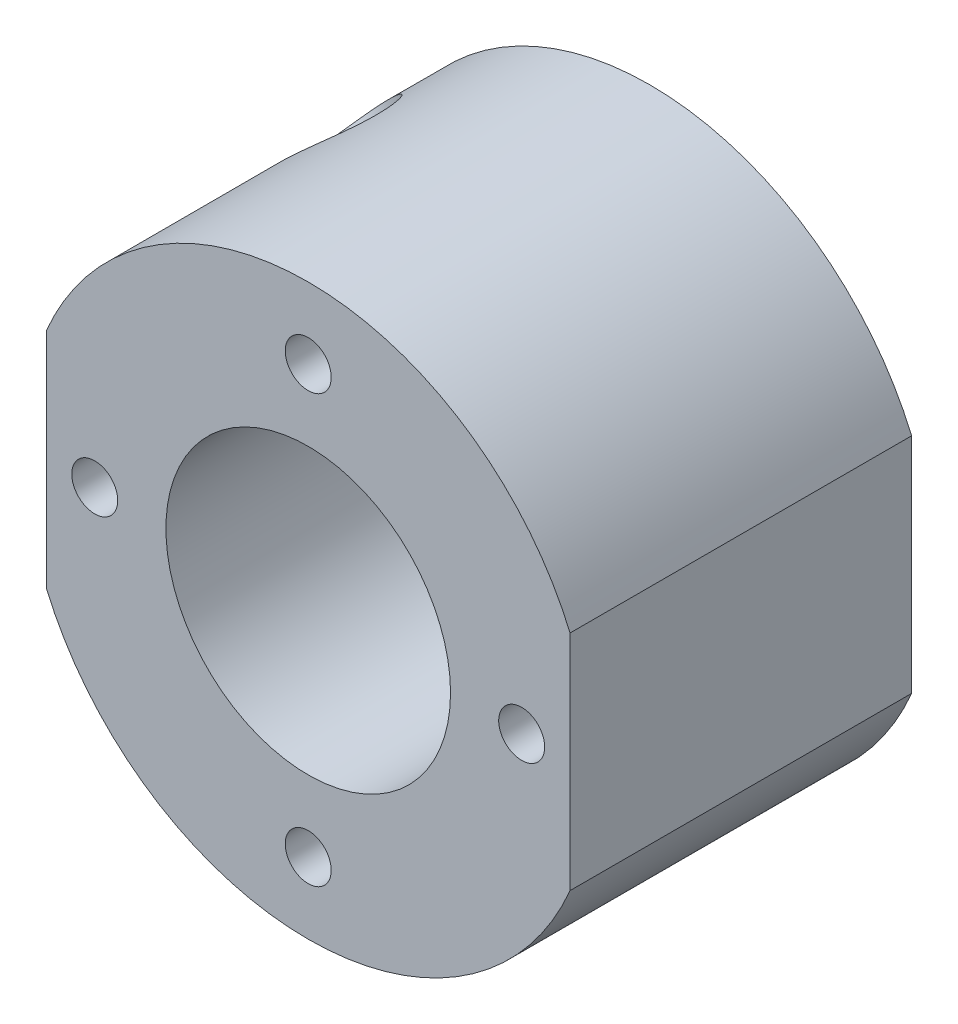
ISO-10303-21;
HEADER;
FILE_DESCRIPTION(('STEP AP214'),'2;1');
FILE_NAME('part.step','',(''),(''),'','','');
FILE_SCHEMA(('AUTOMOTIVE_DESIGN { 1 0 10303 214 1 1 1 1 }'));
ENDSEC;
DATA;
#1=APPLICATION_CONTEXT('core data for automotive mechanical design processes');
#2=APPLICATION_PROTOCOL_DEFINITION('international standard','automotive_design',2000,#1);
#3=PRODUCT_CONTEXT('',#1,'mechanical');
#4=PRODUCT('Part','Part','',(#3));
#5=PRODUCT_RELATED_PRODUCT_CATEGORY('part','',(#4));
#6=PRODUCT_DEFINITION_FORMATION('','',#4);
#7=PRODUCT_DEFINITION_CONTEXT('part definition',#1,'design');
#8=PRODUCT_DEFINITION('design','',#6,#7);
#9=PRODUCT_DEFINITION_SHAPE('','',#8);
#10=(LENGTH_UNIT() NAMED_UNIT(*) SI_UNIT(.MILLI.,.METRE.));
#11=(NAMED_UNIT(*) PLANE_ANGLE_UNIT() SI_UNIT($,.RADIAN.));
#12=(NAMED_UNIT(*) SI_UNIT($,.STERADIAN.) SOLID_ANGLE_UNIT());
#13=UNCERTAINTY_MEASURE_WITH_UNIT(LENGTH_MEASURE(1.E-05),#10,'distance_accuracy_value','');
#14=(GEOMETRIC_REPRESENTATION_CONTEXT(3) GLOBAL_UNCERTAINTY_ASSIGNED_CONTEXT((#13)) GLOBAL_UNIT_ASSIGNED_CONTEXT((#10,
#11,#12)) REPRESENTATION_CONTEXT('',''));
#15=CARTESIAN_POINT('',(0.,0.,0.));
#16=DIRECTION('',(0.,0.,1.));
#17=DIRECTION('',(1.,0.,0.));
#18=AXIS2_PLACEMENT_3D('',#15,#16,#17);
#19=CARTESIAN_POINT('',(0.,0.,30.));
#20=DIRECTION('',(0.,0.,-1.));
#21=DIRECTION('',(-1.,0.,0.));
#22=AXIS2_PLACEMENT_3D('',#19,#20,#21);
#23=CYLINDRICAL_SURFACE('',#22,25.);
#24=CARTESIAN_POINT('',(-20.0332050080004,14.9556242633809,6.91023024597755));
#25=CARTESIAN_POINT('',(-19.9287063934799,15.0955985597925,6.70821432387531));
#26=CARTESIAN_POINT('',(-19.8125774078437,15.2480893048571,6.52071400679506));
#27=CARTESIAN_POINT('',(-19.55866430455,15.5724448581325,6.18004120157919));
#28=CARTESIAN_POINT('',(-19.4208623982199,15.7443255481422,6.0268971651168));
#29=CARTESIAN_POINT('',(-19.1259026800403,16.1013476581232,5.75942461624544));
#30=CARTESIAN_POINT('',(-18.9687395079276,16.2864927444457,5.64510688615283));
#31=CARTESIAN_POINT('',(-18.6383441964005,16.6635794148504,5.4588773054193));
#32=CARTESIAN_POINT('',(-18.4651164437809,16.8555191347054,5.38695391728274));
#33=CARTESIAN_POINT('',(-18.1090026496365,17.2374980909467,5.28838876364411));
#34=CARTESIAN_POINT('',(-17.9262619983531,17.4275315864336,5.26119971038429));
#35=CARTESIAN_POINT('',(-17.5542018287811,17.8022383051362,5.25127960944358));
#36=CARTESIAN_POINT('',(-17.3648826034947,17.9869117664113,5.2685465842377));
#37=CARTESIAN_POINT('',(-16.9876648284346,18.3435505715674,5.34649363316186));
#38=CARTESIAN_POINT('',(-16.7997766378151,18.5156422034272,5.40664823033089));
#39=CARTESIAN_POINT('',(-16.4290083835832,18.8454049716102,5.56792625292055));
#40=CARTESIAN_POINT('',(-16.2461285604558,19.0030754163235,5.6690516419535));
#41=CARTESIAN_POINT('',(-15.8897704914387,19.3020678054954,5.91034499956599));
#42=CARTESIAN_POINT('',(-15.716387915255,19.4432355326298,6.0508450845756));
#43=CARTESIAN_POINT('',(-15.3866554882491,19.7052087669399,6.36654304788941));
#44=CARTESIAN_POINT('',(-15.2303074993113,19.8260120490652,6.54174471319887));
#45=CARTESIAN_POINT('',(-14.9376928590393,20.0474348374352,6.92540557682946));
#46=CARTESIAN_POINT('',(-14.8018182464355,20.1476710755374,7.13438538554393));
#47=CARTESIAN_POINT('',(-14.5586969091372,20.3240492962131,7.57764774059796));
#48=CARTESIAN_POINT('',(-14.4514505264438,20.4001909909484,7.81193058916794));
#49=CARTESIAN_POINT('',(-14.2698280318802,20.5276498791749,8.29981335928426));
#50=CARTESIAN_POINT('',(-14.1955158750061,20.5789187902996,8.55344975420847));
#51=CARTESIAN_POINT('',(-14.0833477713645,20.6558465301357,9.07239376590262));
#52=CARTESIAN_POINT('',(-14.0454880253928,20.6815080277559,9.33770016336749));
#53=CARTESIAN_POINT('',(-14.0082123101428,20.706774099192,9.86852267508543));
#54=CARTESIAN_POINT('',(-14.0082720222142,20.7067340524521,10.1339851677836));
#55=CARTESIAN_POINT('',(-14.0455192208603,20.681486458748,10.6610708923707));
#56=CARTESIAN_POINT('',(-14.0827056261775,20.6562796447271,10.9226942358439));
#57=CARTESIAN_POINT('',(-14.1922305591425,20.5811788662343,11.4332191720971));
#58=CARTESIAN_POINT('',(-14.2643720063603,20.5314232820725,11.6821835438694));
#59=CARTESIAN_POINT('',(-14.440664532367,20.4078106796837,12.1621473013387));
#60=CARTESIAN_POINT('',(-14.5448182049398,20.3339517084549,12.3931452294072));
#61=CARTESIAN_POINT('',(-14.7824133067166,20.1618936737046,12.8336514674126));
#62=CARTESIAN_POINT('',(-14.9161930852507,20.0634115687872,13.0428667248079));
#63=CARTESIAN_POINT('',(-15.2071664759439,19.8437708519755,13.4309251639909));
#64=CARTESIAN_POINT('',(-15.36436173669,19.7226106432555,13.6097662053568));
#65=CARTESIAN_POINT('',(-15.6980338209317,19.4580935961814,13.9336688138318));
#66=CARTESIAN_POINT('',(-15.8746792586924,19.314537280783,14.0783941878825));
#67=CARTESIAN_POINT('',(-16.2397174148653,19.008634904286,14.3275858903805));
#68=CARTESIAN_POINT('',(-16.4281092798501,18.8462902075108,14.4320551396549));
#69=CARTESIAN_POINT('',(-16.8081796761071,18.5080817502816,14.5966290318184));
#70=CARTESIAN_POINT('',(-16.9998040357054,18.3323752410588,14.6571815027394));
#71=CARTESIAN_POINT('',(-17.3819805864821,17.9704192272476,14.7337196851817));
#72=CARTESIAN_POINT('',(-17.5725328975655,17.784170928573,14.7497104838055));
#73=CARTESIAN_POINT('',(-17.9436487805272,17.4095906990046,14.7367217996727));
#74=CARTESIAN_POINT('',(-18.124325719045,17.2213448194854,14.7084851721147));
#75=CARTESIAN_POINT('',(-18.4742130929309,16.8454565688639,14.6093250683516));
#76=CARTESIAN_POINT('',(-18.6434234931844,16.6578141996115,14.5384014614313));
#77=CARTESIAN_POINT('',(-18.9665591773802,16.2889489744697,14.3559789469341));
#78=CARTESIAN_POINT('',(-19.1204724093069,16.1077312514788,14.2444483643499));
#79=CARTESIAN_POINT('',(-19.4098640693997,15.7578170863309,13.984069692164));
#80=CARTESIAN_POINT('',(-19.5453405643748,15.5891219580769,13.8352176938553));
#81=CARTESIAN_POINT('',(-19.7977950218222,15.2672825043082,13.5014782350919));
#82=CARTESIAN_POINT('',(-19.9144194414495,15.1144512171008,13.3160213038499));
#83=CARTESIAN_POINT('',(-20.1247229153359,14.8332879191097,12.9158204216847));
#84=CARTESIAN_POINT('',(-20.2184004393244,14.7049575423557,12.7010745190395));
#85=CARTESIAN_POINT('',(-20.3824740257899,14.4766975837517,12.2459269480198));
#86=CARTESIAN_POINT('',(-20.4526391762873,14.3770509709516,12.0052998263121));
#87=CARTESIAN_POINT('',(-20.5676505013571,14.2120349692608,11.5068608666643));
#88=CARTESIAN_POINT('',(-20.6124993146063,14.1466620081392,11.2490508228024));
#89=CARTESIAN_POINT('',(-20.6760752266503,14.0535793377942,10.7263338165391));
#90=CARTESIAN_POINT('',(-20.695062997456,14.0254938551046,10.4615255249159));
#91=CARTESIAN_POINT('',(-20.7075578346279,14.0070406065217,9.92996415976184));
#92=CARTESIAN_POINT('',(-20.7010627190839,14.0166760703928,9.6632109216515));
#93=CARTESIAN_POINT('',(-20.6628792758397,14.0729003527401,9.13852206335549));
#94=CARTESIAN_POINT('',(-20.6314720099464,14.1190768968851,8.88052136393451));
#95=CARTESIAN_POINT('',(-20.5441508985975,14.2458323777527,8.37759924907437));
#96=CARTESIAN_POINT('',(-20.4882549475655,14.3263861931321,8.13266842951528));
#97=CARTESIAN_POINT('',(-20.3692515340359,14.4948742030161,7.72016751666249));
#98=CARTESIAN_POINT('',(-20.3112651827072,14.5761661312453,7.54834495334402));
#99=CARTESIAN_POINT('',(-20.1820610427669,14.7545435642983,7.2184206466158));
#100=CARTESIAN_POINT('',(-20.110842915422,14.8516294734397,7.06031925461986));
#101=CARTESIAN_POINT('',(-20.0332050080004,14.9556242633809,6.91023024597755));
#102=B_SPLINE_CURVE_WITH_KNOTS('',3,(#24,#25,#26,#27,#28,#29,#30,#31,#32,#33,#34,#35,#36,#37,
#38,#39,#40,#41,#42,#43,#44,#45,#46,#47,#48,#49,#50,#51,#52,#53,#54,#55,#56,#57,#58,#59,#60,#61,
#62,#63,#64,#65,#66,#67,#68,#69,#70,#71,#72,#73,#74,#75,#76,#77,#78,#79,#80,#81,#82,#83,#84,#85,
#86,#87,#88,#89,#90,#91,#92,#93,#94,#95,#96,#97,#98,#99,#100,#101),.UNSPECIFIED.,.T.,.F.,(4,2,2,
2,2,2,2,2,2,2,2,2,2,2,2,2,2,2,2,2,2,2,2,2,2,2,2,2,2,2,2,2,2,2,2,2,2,2,4),(0.,0.800483583623166,
1.60162764933025,2.40299401635645,3.20414219306571,3.99541405810369,4.78665072582606,
5.56835584573025,6.35009843494714,7.13864428502347,7.92727623706531,8.72948460596087,
9.53170255783908,10.3354715835523,11.139156828435,11.9317296291704,12.7242793481191,
13.512411681542,14.3006078900636,15.0983182075175,15.8960847150241,16.7014117122949,
17.5066802671775,18.303617243157,19.1004632381226,19.8840680523859,20.6676752662008,
21.4518950380332,22.2361969762747,23.0338291649404,23.8315145312159,24.6368187599172,
25.4420390376899,26.2390813137089,27.0361918360287,27.8244350244597,28.6121031843612,
29.2068123054358,29.8015366531514),.UNSPECIFIED.);
#103=CARTESIAN_POINT('',(-20.0332050080004,14.9556242633809,6.91023024597755));
#104=VERTEX_POINT('',#103);
#105=EDGE_CURVE('E13',#104,#104,#102,.T.);
#106=ORIENTED_EDGE('',*,*,#105,.T.);
#107=EDGE_LOOP('',(#106));
#108=FACE_BOUND('',#107,.T.);
#109=CARTESIAN_POINT('',(0.,0.,0.));
#110=DIRECTION('',(0.,0.,1.));
#111=DIRECTION('',(1.,0.,0.));
#112=AXIS2_PLACEMENT_3D('',#109,#110,#111);
#113=CIRCLE('',#112,25.);
#114=CARTESIAN_POINT('',(23.,9.79795897113274,0.));
#115=VERTEX_POINT('',#114);
#116=CARTESIAN_POINT('',(-23.,9.79795897113273,0.));
#117=VERTEX_POINT('',#116);
#118=EDGE_CURVE('E118',#115,#117,#113,.T.);
#119=ORIENTED_EDGE('',*,*,#118,.T.);
#120=DIRECTION('',(0.,0.,-1.));
#121=VECTOR('',#120,1.);
#122=CARTESIAN_POINT('',(-23.,9.79795897113273,30.));
#123=LINE('',#122,#121);
#124=CARTESIAN_POINT('',(-23.,9.79795897113273,30.));
#125=VERTEX_POINT('',#124);
#126=EDGE_CURVE('E60',#125,#117,#123,.T.);
#127=ORIENTED_EDGE('',*,*,#126,.F.);
#128=CARTESIAN_POINT('',(0.,0.,30.));
#129=DIRECTION('',(0.,0.,1.));
#130=DIRECTION('',(1.,0.,0.));
#131=AXIS2_PLACEMENT_3D('',#128,#129,#130);
#132=CIRCLE('',#131,25.);
#133=CARTESIAN_POINT('',(23.,9.79795897113274,30.));
#134=VERTEX_POINT('',#133);
#135=EDGE_CURVE('E104',#134,#125,#132,.T.);
#136=ORIENTED_EDGE('',*,*,#135,.F.);
#137=DIRECTION('',(0.,0.,-1.));
#138=VECTOR('',#137,1.);
#139=CARTESIAN_POINT('',(23.,9.79795897113274,30.));
#140=LINE('',#139,#138);
#141=EDGE_CURVE('E114',#134,#115,#140,.T.);
#142=ORIENTED_EDGE('',*,*,#141,.T.);
#143=EDGE_LOOP('',(#119,#127,#136,#142));
#144=FACE_BOUND('',#143,.T.);
#145=ADVANCED_FACE('F48',(#108,#144),#23,.T.);
#146=CARTESIAN_POINT('',(-23.,9.79795897113273,30.));
#147=DIRECTION('',(1.,0.,0.));
#148=DIRECTION('',(0.,0.,-1.));
#149=AXIS2_PLACEMENT_3D('',#146,#147,#148);
#150=PLANE('',#149);
#151=DIRECTION('',(0.,-1.,0.));
#152=VECTOR('',#151,1.);
#153=CARTESIAN_POINT('',(-23.,9.79795897113273,0.));
#154=LINE('',#153,#152);
#155=CARTESIAN_POINT('',(-23.,-9.79795897113273,0.));
#156=VERTEX_POINT('',#155);
#157=EDGE_CURVE('E109',#117,#156,#154,.T.);
#158=ORIENTED_EDGE('',*,*,#157,.T.);
#159=DIRECTION('',(0.,0.,-1.));
#160=VECTOR('',#159,1.);
#161=CARTESIAN_POINT('',(-23.,-9.79795897113273,30.));
#162=LINE('',#161,#160);
#163=CARTESIAN_POINT('',(-23.,-9.79795897113273,30.));
#164=VERTEX_POINT('',#163);
#165=EDGE_CURVE('E107',#164,#156,#162,.T.);
#166=ORIENTED_EDGE('',*,*,#165,.F.);
#167=DIRECTION('',(0.,-1.,0.));
#168=VECTOR('',#167,1.);
#169=CARTESIAN_POINT('',(-23.,9.79795897113273,30.));
#170=LINE('',#169,#168);
#171=EDGE_CURVE('E99',#125,#164,#170,.T.);
#172=ORIENTED_EDGE('',*,*,#171,.F.);
#173=ORIENTED_EDGE('',*,*,#126,.T.);
#174=EDGE_LOOP('',(#158,#166,#172,#173));
#175=FACE_BOUND('',#174,.T.);
#176=ADVANCED_FACE('F108',(#175),#150,.F.);
#177=CARTESIAN_POINT('',(0.,0.,30.));
#178=DIRECTION('',(0.,0.,-1.));
#179=DIRECTION('',(-1.,0.,0.));
#180=AXIS2_PLACEMENT_3D('',#177,#178,#179);
#181=CYLINDRICAL_SURFACE('',#180,25.);
#182=CARTESIAN_POINT('',(0.,0.,0.));
#183=DIRECTION('',(0.,0.,1.));
#184=DIRECTION('',(1.,0.,0.));
#185=AXIS2_PLACEMENT_3D('',#182,#183,#184);
#186=CIRCLE('',#185,25.);
#187=CARTESIAN_POINT('',(23.,-9.79795897113272,0.));
#188=VERTEX_POINT('',#187);
#189=EDGE_CURVE('E85',#156,#188,#186,.T.);
#190=ORIENTED_EDGE('',*,*,#189,.T.);
#191=DIRECTION('',(0.,0.,-1.));
#192=VECTOR('',#191,1.);
#193=CARTESIAN_POINT('',(23.,-9.79795897113272,30.));
#194=LINE('',#193,#192);
#195=CARTESIAN_POINT('',(23.,-9.79795897113272,30.));
#196=VERTEX_POINT('',#195);
#197=EDGE_CURVE('E110',#196,#188,#194,.T.);
#198=ORIENTED_EDGE('',*,*,#197,.F.);
#199=CARTESIAN_POINT('',(0.,0.,30.));
#200=DIRECTION('',(0.,0.,1.));
#201=DIRECTION('',(1.,0.,0.));
#202=AXIS2_PLACEMENT_3D('',#199,#200,#201);
#203=CIRCLE('',#202,25.);
#204=EDGE_CURVE('E102',#164,#196,#203,.T.);
#205=ORIENTED_EDGE('',*,*,#204,.F.);
#206=ORIENTED_EDGE('',*,*,#165,.T.);
#207=EDGE_LOOP('',(#190,#198,#205,#206));
#208=FACE_BOUND('',#207,.T.);
#209=ADVANCED_FACE('F112',(#208),#181,.T.);
#210=CARTESIAN_POINT('',(23.,9.79795897113274,30.));
#211=DIRECTION('',(-1.,0.,0.));
#212=DIRECTION('',(0.,-1.,0.));
#213=AXIS2_PLACEMENT_3D('',#210,#211,#212);
#214=PLANE('',#213);
#215=DIRECTION('',(0.,1.,0.));
#216=VECTOR('',#215,1.);
#217=CARTESIAN_POINT('',(23.,9.79795897113274,0.));
#218=LINE('',#217,#216);
#219=EDGE_CURVE('E91',#188,#115,#218,.T.);
#220=ORIENTED_EDGE('',*,*,#219,.T.);
#221=ORIENTED_EDGE('',*,*,#141,.F.);
#222=DIRECTION('',(0.,1.,0.));
#223=VECTOR('',#222,1.);
#224=CARTESIAN_POINT('',(23.,9.79795897113274,30.));
#225=LINE('',#224,#223);
#226=EDGE_CURVE('E68',#196,#134,#225,.T.);
#227=ORIENTED_EDGE('',*,*,#226,.F.);
#228=ORIENTED_EDGE('',*,*,#197,.T.);
#229=EDGE_LOOP('',(#220,#221,#227,#228));
#230=FACE_BOUND('',#229,.T.);
#231=ADVANCED_FACE('F141',(#230),#214,.F.);
#232=CARTESIAN_POINT('',(0.,0.,30.));
#233=DIRECTION('',(0.,0.,1.));
#234=DIRECTION('',(1.,0.,0.));
#235=AXIS2_PLACEMENT_3D('',#232,#233,#234);
#236=PLANE('',#235);
#237=CARTESIAN_POINT('',(-18.75,0.,30.));
#238=DIRECTION('',(0.,0.,1.));
#239=DIRECTION('',(1.,0.,0.));
#240=AXIS2_PLACEMENT_3D('',#237,#238,#239);
#241=CIRCLE('',#240,2.01929999999999);
#242=CARTESIAN_POINT('',(-16.7307,0.,30.));
#243=VERTEX_POINT('',#242);
#244=EDGE_CURVE('E184',#243,#243,#241,.T.);
#245=ORIENTED_EDGE('',*,*,#244,.F.);
#246=EDGE_LOOP('',(#245));
#247=FACE_BOUND('',#246,.T.);
#248=CARTESIAN_POINT('',(0.,18.75,30.));
#249=DIRECTION('',(0.,0.,1.));
#250=DIRECTION('',(1.,0.,0.));
#251=AXIS2_PLACEMENT_3D('',#248,#249,#250);
#252=CIRCLE('',#251,2.01929999999999);
#253=CARTESIAN_POINT('',(2.01929999999999,18.75,30.));
#254=VERTEX_POINT('',#253);
#255=EDGE_CURVE('E191',#254,#254,#252,.T.);
#256=ORIENTED_EDGE('',*,*,#255,.F.);
#257=EDGE_LOOP('',(#256));
#258=FACE_BOUND('',#257,.T.);
#259=CARTESIAN_POINT('',(18.75,0.,30.));
#260=DIRECTION('',(0.,0.,1.));
#261=DIRECTION('',(1.,0.,0.));
#262=AXIS2_PLACEMENT_3D('',#259,#260,#261);
#263=CIRCLE('',#262,2.01929999999999);
#264=CARTESIAN_POINT('',(20.7693,0.,30.));
#265=VERTEX_POINT('',#264);
#266=EDGE_CURVE('E197',#265,#265,#263,.T.);
#267=ORIENTED_EDGE('',*,*,#266,.F.);
#268=EDGE_LOOP('',(#267));
#269=FACE_BOUND('',#268,.T.);
#270=CARTESIAN_POINT('',(0.,-18.75,30.));
#271=DIRECTION('',(0.,0.,1.));
#272=DIRECTION('',(1.,0.,0.));
#273=AXIS2_PLACEMENT_3D('',#270,#271,#272);
#274=CIRCLE('',#273,2.01929999999999);
#275=CARTESIAN_POINT('',(2.01929999999999,-18.75,30.));
#276=VERTEX_POINT('',#275);
#277=EDGE_CURVE('E203',#276,#276,#274,.T.);
#278=ORIENTED_EDGE('',*,*,#277,.F.);
#279=EDGE_LOOP('',(#278));
#280=FACE_BOUND('',#279,.T.);
#281=CARTESIAN_POINT('',(0.,0.,30.));
#282=DIRECTION('',(0.,0.,1.));
#283=DIRECTION('',(1.,0.,0.));
#284=AXIS2_PLACEMENT_3D('',#281,#282,#283);
#285=CIRCLE('',#284,12.5);
#286=CARTESIAN_POINT('',(12.5,0.,30.));
#287=VERTEX_POINT('',#286);
#288=EDGE_CURVE('E209',#287,#287,#285,.T.);
#289=ORIENTED_EDGE('',*,*,#288,.F.);
#290=EDGE_LOOP('',(#289));
#291=FACE_BOUND('',#290,.T.);
#292=ORIENTED_EDGE('',*,*,#135,.T.);
#293=ORIENTED_EDGE('',*,*,#171,.T.);
#294=ORIENTED_EDGE('',*,*,#204,.T.);
#295=ORIENTED_EDGE('',*,*,#226,.T.);
#296=EDGE_LOOP('',(#292,#293,#294,#295));
#297=FACE_BOUND('',#296,.T.);
#298=ADVANCED_FACE('F100',(#247,#258,#269,#280,#291,#297),#236,.T.);
#299=CARTESIAN_POINT('',(0.,0.,0.));
#300=DIRECTION('',(0.,0.,1.));
#301=DIRECTION('',(1.,0.,0.));
#302=AXIS2_PLACEMENT_3D('',#299,#300,#301);
#303=PLANE('',#302);
#304=CARTESIAN_POINT('',(-18.75,0.,0.));
#305=DIRECTION('',(0.,0.,1.));
#306=DIRECTION('',(1.,0.,0.));
#307=AXIS2_PLACEMENT_3D('',#304,#305,#306);
#308=CIRCLE('',#307,2.0193);
#309=CARTESIAN_POINT('',(-16.7307,0.,0.));
#310=VERTEX_POINT('',#309);
#311=EDGE_CURVE('E189',#310,#310,#308,.T.);
#312=ORIENTED_EDGE('',*,*,#311,.T.);
#313=EDGE_LOOP('',(#312));
#314=FACE_BOUND('',#313,.T.);
#315=CARTESIAN_POINT('',(0.,18.75,0.));
#316=DIRECTION('',(0.,0.,1.));
#317=DIRECTION('',(1.,0.,0.));
#318=AXIS2_PLACEMENT_3D('',#315,#316,#317);
#319=CIRCLE('',#318,2.0193);
#320=CARTESIAN_POINT('',(2.0193,18.75,0.));
#321=VERTEX_POINT('',#320);
#322=EDGE_CURVE('E194',#321,#321,#319,.T.);
#323=ORIENTED_EDGE('',*,*,#322,.T.);
#324=EDGE_LOOP('',(#323));
#325=FACE_BOUND('',#324,.T.);
#326=CARTESIAN_POINT('',(18.75,0.,0.));
#327=DIRECTION('',(0.,0.,1.));
#328=DIRECTION('',(1.,0.,0.));
#329=AXIS2_PLACEMENT_3D('',#326,#327,#328);
#330=CIRCLE('',#329,2.0193);
#331=CARTESIAN_POINT('',(20.7693,0.,0.));
#332=VERTEX_POINT('',#331);
#333=EDGE_CURVE('E200',#332,#332,#330,.T.);
#334=ORIENTED_EDGE('',*,*,#333,.T.);
#335=EDGE_LOOP('',(#334));
#336=FACE_BOUND('',#335,.T.);
#337=CARTESIAN_POINT('',(0.,-18.75,0.));
#338=DIRECTION('',(0.,0.,1.));
#339=DIRECTION('',(1.,0.,0.));
#340=AXIS2_PLACEMENT_3D('',#337,#338,#339);
#341=CIRCLE('',#340,2.0193);
#342=CARTESIAN_POINT('',(2.0193,-18.75,0.));
#343=VERTEX_POINT('',#342);
#344=EDGE_CURVE('E206',#343,#343,#341,.T.);
#345=ORIENTED_EDGE('',*,*,#344,.T.);
#346=EDGE_LOOP('',(#345));
#347=FACE_BOUND('',#346,.T.);
#348=ORIENTED_EDGE('',*,*,#118,.F.);
#349=ORIENTED_EDGE('',*,*,#219,.F.);
#350=ORIENTED_EDGE('',*,*,#189,.F.);
#351=ORIENTED_EDGE('',*,*,#157,.F.);
#352=EDGE_LOOP('',(#348,#349,#350,#351));
#353=FACE_BOUND('',#352,.T.);
#354=ADVANCED_FACE('F129',(#314,#325,#336,#347,#353),#303,.F.);
#355=CARTESIAN_POINT('',(0.,0.,5.));
#356=DIRECTION('',(0.,0.,1.));
#357=DIRECTION('',(1.,0.,0.));
#358=AXIS2_PLACEMENT_3D('',#355,#356,#357);
#359=CYLINDRICAL_SURFACE('',#358,12.5);
#360=CARTESIAN_POINT('',(-11.3022614296406,5.33937136525064,10.));
#361=CARTESIAN_POINT('',(-11.302261712478,5.33936929304076,10.2294839553185));
#362=CARTESIAN_POINT('',(-11.2937676837508,5.35746240151279,10.4589569113839));
#363=CARTESIAN_POINT('',(-11.2597063278864,5.42867731557479,10.9110933229938));
#364=CARTESIAN_POINT('',(-11.2341365263395,5.48180419781198,11.1337557867547));
#365=CARTESIAN_POINT('',(-11.1657348668228,5.61980657831726,11.565645899567));
#366=CARTESIAN_POINT('',(-11.1229374923958,5.70461862977633,11.7748994243859));
#367=CARTESIAN_POINT('',(-11.0196714489685,5.90162405513604,12.1753675170518));
#368=CARTESIAN_POINT('',(-10.9591987360722,6.01382369400369,12.3665779436067));
#369=CARTESIAN_POINT('',(-10.8175745942932,6.26510811357329,12.7331952211665));
#370=CARTESIAN_POINT('',(-10.7357507645691,6.4050226458383,12.9077738054365));
#371=CARTESIAN_POINT('',(-10.5522367381003,6.70305074707126,13.2287250678662));
#372=CARTESIAN_POINT('',(-10.4505432696072,6.8611673114345,13.3750930929606));
#373=CARTESIAN_POINT('',(-10.224414305035,7.1939440027281,13.6392473351564));
#374=CARTESIAN_POINT('',(-10.0994425223658,7.36893385708976,13.7561627682753));
#375=CARTESIAN_POINT('',(-9.82988663793416,7.72483436972402,13.9523254812632));
#376=CARTESIAN_POINT('',(-9.68530797123938,7.90574337668832,14.0315831726101));
#377=CARTESIAN_POINT('',(-9.38469611653335,8.26011619047066,14.1473631452391));
#378=CARTESIAN_POINT('',(-9.22925311662407,8.43361597582371,14.185304949743));
#379=CARTESIAN_POINT('',(-8.90661384259967,8.77365951063835,14.2218928471177));
#380=CARTESIAN_POINT('',(-8.73942068058778,8.94020508347614,14.2205493061193));
#381=CARTESIAN_POINT('',(-8.40537818171642,9.2547380321743,14.1794983597972));
#382=CARTESIAN_POINT('',(-8.23878456539207,9.40320204680099,14.1413334470189));
#383=CARTESIAN_POINT('',(-7.90488237766781,9.68559093863214,14.0302779081067));
#384=CARTESIAN_POINT('',(-7.7375737582933,9.81951482379697,13.9573849143816));
#385=CARTESIAN_POINT('',(-7.40557200066457,10.0723213215478,13.7780591525081));
#386=CARTESIAN_POINT('',(-7.2409432666575,10.1909801345262,13.6711930959813));
#387=CARTESIAN_POINT('',(-6.92223116298989,10.4100996942391,13.4273139931239));
#388=CARTESIAN_POINT('',(-6.76815079075291,10.5105552815885,13.2902924240353));
#389=CARTESIAN_POINT('',(-6.46896199531857,10.6974365240854,12.9822490429054));
#390=CARTESIAN_POINT('',(-6.32464255818079,10.7829539751426,12.8099079998999));
#391=CARTESIAN_POINT('',(-6.05966021370939,10.9340680323492,12.4400721598059));
#392=CARTESIAN_POINT('',(-5.93900113724244,10.9996614135199,12.2425732979215));
#393=CARTESIAN_POINT('',(-5.72555611093733,11.1122835300729,11.8241419233486));
#394=CARTESIAN_POINT('',(-5.63321250143286,11.1590209312513,11.6029039603696));
#395=CARTESIAN_POINT('',(-5.48425563359005,11.2329843874649,11.1456450268121));
#396=CARTESIAN_POINT('',(-5.42762696874533,11.2602188562501,10.9096304788368));
#397=CARTESIAN_POINT('',(-5.35549446046495,11.294698451964,10.4411660007525));
#398=CARTESIAN_POINT('',(-5.33821613263439,11.3028067110328,10.2090528044696));
#399=CARTESIAN_POINT('',(-5.34064635937995,11.3016595704924,9.74508897777897));
#400=CARTESIAN_POINT('',(-5.36034798745674,11.2924074225598,9.51323830633805));
#401=CARTESIAN_POINT('',(-5.43409726779883,11.2570927563104,9.06495914213683));
#402=CARTESIAN_POINT('',(-5.48690189787595,11.2316381331995,8.84827532034871));
#403=CARTESIAN_POINT('',(-5.62273840505514,11.1642519448336,8.42731669711977));
#404=CARTESIAN_POINT('',(-5.70577572135325,11.1223174145522,8.22304413632417));
#405=CARTESIAN_POINT('',(-5.90110090400805,11.0199594383216,7.82539434146029));
#406=CARTESIAN_POINT('',(-6.01424671075541,10.9589826958563,7.632581919724));
#407=CARTESIAN_POINT('',(-6.26329156855859,10.8185757940429,7.26968094926901));
#408=CARTESIAN_POINT('',(-6.39919747975015,10.7391400681559,7.09959927971352));
#409=CARTESIAN_POINT('',(-6.69553552925017,10.5570575316378,6.77829080111957));
#410=CARTESIAN_POINT('',(-6.85684823584516,10.4534570699993,6.6284125152604));
#411=CARTESIAN_POINT('',(-7.19212077221709,10.2256741936143,6.36212316327955));
#412=CARTESIAN_POINT('',(-7.36608018518755,10.101492457007,6.24571099481721));
#413=CARTESIAN_POINT('',(-7.71880383986416,9.83456223519756,6.0507060659488));
#414=CARTESIAN_POINT('',(-7.89752991026835,9.6919385087077,5.97187450709005));
#415=CARTESIAN_POINT('',(-8.25407687790496,9.39013680402259,5.85387977908275));
#416=CARTESIAN_POINT('',(-8.43189808627631,9.23096498535467,5.81470190792742));
#417=CARTESIAN_POINT('',(-8.77183999362603,8.90826116043518,5.77847475782879));
#418=CARTESIAN_POINT('',(-8.93430454839983,8.74530615225647,5.7794916642106));
#419=CARTESIAN_POINT('',(-9.24782354705296,8.41308007498958,5.81883635127718));
#420=CARTESIAN_POINT('',(-9.39887895315723,8.24380954034332,5.85716098170774));
#421=CARTESIAN_POINT('',(-9.68357810911803,7.90734658157347,5.96874171478897));
#422=CARTESIAN_POINT('',(-9.81746917728791,7.74016627920157,6.04140765811164));
#423=CARTESIAN_POINT('',(-10.0685961709915,7.41055664043554,6.21905864203931));
#424=CARTESIAN_POINT('',(-10.1858290547031,7.24812817602682,6.32404957420445));
#425=CARTESIAN_POINT('',(-10.4066569463334,6.92754019401204,6.56789783957921));
#426=CARTESIAN_POINT('',(-10.5095757281979,6.76976913804523,6.70787745787671));
#427=CARTESIAN_POINT('',(-10.6961412037822,6.47098497335769,7.01583387033959));
#428=CARTESIAN_POINT('',(-10.7797816534479,6.32997730126545,7.18381970515699));
#429=CARTESIAN_POINT('',(-10.9310670614122,6.06514624297628,7.55112253123494));
#430=CARTESIAN_POINT('',(-10.9979302359028,5.9422460576191,7.7514303806918));
#431=CARTESIAN_POINT('',(-11.1116276828779,5.7268348245265,8.17299168734388));
#432=CARTESIAN_POINT('',(-11.1584665890157,5.63431674746437,8.39424028432178));
#433=CARTESIAN_POINT('',(-11.2312497421681,5.48776078458269,8.84308785090615));
#434=CARTESIAN_POINT('',(-11.2579069972401,5.43241847804904,9.07014370055966));
#435=CARTESIAN_POINT('',(-11.2934094222825,5.35823153523335,9.53147197762508));
#436=CARTESIAN_POINT('',(-11.3022611409188,5.33937348057205,9.76574171965465));
#437=CARTESIAN_POINT('',(-11.3022614296406,5.33937136525064,10.));
#438=B_SPLINE_CURVE_WITH_KNOTS('',3,(#360,#361,#362,#363,#364,#365,#366,#367,#368,#369,#370,
#371,#372,#373,#374,#375,#376,#377,#378,#379,#380,#381,#382,#383,#384,#385,#386,#387,#388,#389,
#390,#391,#392,#393,#394,#395,#396,#397,#398,#399,#400,#401,#402,#403,#404,#405,#406,#407,#408,
#409,#410,#411,#412,#413,#414,#415,#416,#417,#418,#419,#420,#421,#422,#423,#424,#425,#426,#427,
#428,#429,#430,#431,#432,#433,#434,#435,#436,#437),.UNSPECIFIED.,.T.,.F.,(4,2,2,2,2,2,2,2,2,2,2,
2,2,2,2,2,2,2,2,2,2,2,2,2,2,2,2,2,2,2,2,2,2,2,2,2,2,2,4),(0.,0.687583923421879,1.37526750462882,
2.06158137603121,2.74805239051351,3.45950333766448,4.17107153169591,4.90170319274193,
5.63213273364367,6.33658673386324,7.04085485315743,7.71684628574291,8.39288381072536,
9.0779148472816,9.76313974121443,10.481351401693,11.1996792525162,11.9287157401824,
12.6574375248127,13.3525859787183,14.0476042414242,14.7179705625726,15.3884575497131,
16.0805950808481,16.7729416062538,17.4995295031917,18.2260934643029,18.9479769632526,
19.6695927184255,20.3565350286869,21.0434193387547,21.7189063751818,22.3945165989905,
23.0954606088655,23.7966313292882,24.5261001092891,25.2553999973582,25.9575471273218,
26.6594359686153),.UNSPECIFIED.);
#439=CARTESIAN_POINT('',(-11.3022614296406,5.33937136525064,10.));
#440=VERTEX_POINT('',#439);
#441=EDGE_CURVE('E178',#440,#440,#438,.T.);
#442=ORIENTED_EDGE('',*,*,#441,.T.);
#443=EDGE_LOOP('',(#442));
#444=FACE_BOUND('',#443,.T.);
#445=CARTESIAN_POINT('',(0.,0.,5.));
#446=DIRECTION('',(0.,0.,1.));
#447=DIRECTION('',(1.,0.,0.));
#448=AXIS2_PLACEMENT_3D('',#445,#446,#447);
#449=CIRCLE('',#448,12.5);
#450=CARTESIAN_POINT('',(12.5,0.,5.));
#451=VERTEX_POINT('',#450);
#452=EDGE_CURVE('E121',#451,#451,#449,.T.);
#453=ORIENTED_EDGE('',*,*,#452,.F.);
#454=EDGE_LOOP('',(#453));
#455=FACE_BOUND('',#454,.T.);
#456=ORIENTED_EDGE('',*,*,#288,.T.);
#457=EDGE_LOOP('',(#456));
#458=FACE_BOUND('',#457,.T.);
#459=ADVANCED_FACE('F131',(#444,#455,#458),#359,.F.);
#460=CARTESIAN_POINT('',(0.,0.,5.));
#461=DIRECTION('',(0.,0.,1.));
#462=DIRECTION('',(1.,0.,0.));
#463=AXIS2_PLACEMENT_3D('',#460,#461,#462);
#464=PLANE('',#463);
#465=ORIENTED_EDGE('',*,*,#452,.T.);
#466=EDGE_LOOP('',(#465));
#467=FACE_BOUND('',#466,.T.);
#468=ADVANCED_FACE('F138',(#467),#464,.T.);
#469=CARTESIAN_POINT('',(0.,-18.75,30.));
#470=DIRECTION('',(0.,0.,1.));
#471=DIRECTION('',(1.,0.,0.));
#472=AXIS2_PLACEMENT_3D('',#469,#470,#471);
#473=CYLINDRICAL_SURFACE('',#472,2.01929999999999);
#474=ORIENTED_EDGE('',*,*,#344,.F.);
#475=EDGE_LOOP('',(#474));
#476=FACE_BOUND('',#475,.T.);
#477=ORIENTED_EDGE('',*,*,#277,.T.);
#478=EDGE_LOOP('',(#477));
#479=FACE_BOUND('',#478,.T.);
#480=ADVANCED_FACE('F220',(#476,#479),#473,.F.);
#481=CARTESIAN_POINT('',(18.75,0.,30.));
#482=DIRECTION('',(0.,0.,1.));
#483=DIRECTION('',(1.,0.,0.));
#484=AXIS2_PLACEMENT_3D('',#481,#482,#483);
#485=CYLINDRICAL_SURFACE('',#484,2.01929999999999);
#486=ORIENTED_EDGE('',*,*,#333,.F.);
#487=EDGE_LOOP('',(#486));
#488=FACE_BOUND('',#487,.T.);
#489=ORIENTED_EDGE('',*,*,#266,.T.);
#490=EDGE_LOOP('',(#489));
#491=FACE_BOUND('',#490,.T.);
#492=ADVANCED_FACE('F225',(#488,#491),#485,.F.);
#493=CARTESIAN_POINT('',(0.,18.75,30.));
#494=DIRECTION('',(0.,0.,1.));
#495=DIRECTION('',(1.,0.,0.));
#496=AXIS2_PLACEMENT_3D('',#493,#494,#495);
#497=CYLINDRICAL_SURFACE('',#496,2.01929999999999);
#498=ORIENTED_EDGE('',*,*,#322,.F.);
#499=EDGE_LOOP('',(#498));
#500=FACE_BOUND('',#499,.T.);
#501=ORIENTED_EDGE('',*,*,#255,.T.);
#502=EDGE_LOOP('',(#501));
#503=FACE_BOUND('',#502,.T.);
#504=ADVANCED_FACE('F166',(#500,#503),#497,.F.);
#505=CARTESIAN_POINT('',(-18.75,0.,30.));
#506=DIRECTION('',(0.,0.,1.));
#507=DIRECTION('',(1.,0.,0.));
#508=AXIS2_PLACEMENT_3D('',#505,#506,#507);
#509=CYLINDRICAL_SURFACE('',#508,2.01929999999999);
#510=ORIENTED_EDGE('',*,*,#311,.F.);
#511=EDGE_LOOP('',(#510));
#512=FACE_BOUND('',#511,.T.);
#513=ORIENTED_EDGE('',*,*,#244,.T.);
#514=EDGE_LOOP('',(#513));
#515=FACE_BOUND('',#514,.T.);
#516=ADVANCED_FACE('F157',(#512,#515),#509,.F.);
#517=CARTESIAN_POINT('',(-17.6776695296637,17.6776695296636,10.));
#518=DIRECTION('',(-0.707106781186549,0.707106781186546,0.));
#519=DIRECTION('',(-0.707106781186546,-0.707106781186549,0.));
#520=AXIS2_PLACEMENT_3D('',#517,#518,#519);
#521=CONICAL_SURFACE('',#520,4.744593,0.0299323966717029);
#522=CARTESIAN_POINT('',(-12.7844906038528,12.7844906038527,10.));
#523=DIRECTION('',(-0.707106781186549,0.707106781186546,0.));
#524=DIRECTION('',(-0.707106781186546,-0.707106781186549,0.));
#525=AXIS2_PLACEMENT_3D('',#522,#523,#524);
#526=CIRCLE('',#525,4.53739893293992);
#527=CARTESIAN_POINT('',(-15.9929161582832,9.57606504942231,10.));
#528=VERTEX_POINT('',#527);
#529=EDGE_CURVE('E358',#528,#528,#526,.T.);
#530=ORIENTED_EDGE('',*,*,#529,.F.);
#531=EDGE_LOOP('',(#530));
#532=FACE_BOUND('',#531,.T.);
#533=ORIENTED_EDGE('',*,*,#105,.F.);
#534=EDGE_LOOP('',(#533));
#535=FACE_BOUND('',#534,.T.);
#536=ADVANCED_FACE('F154',(#532,#535),#521,.F.);
#537=CARTESIAN_POINT('',(-17.6776695296637,17.6776695296636,10.));
#538=DIRECTION('',(-0.707106781186549,0.707106781186546,0.));
#539=DIRECTION('',(-0.707106781186546,-0.707106781186549,0.));
#540=AXIS2_PLACEMENT_3D('',#537,#538,#539);
#541=CYLINDRICAL_SURFACE('',#540,4.2164);
#542=ORIENTED_EDGE('',*,*,#441,.F.);
#543=EDGE_LOOP('',(#542));
#544=FACE_BOUND('',#543,.T.);
#545=CARTESIAN_POINT('',(-12.7844906038528,12.7844906038527,10.));
#546=DIRECTION('',(-0.707106781186549,0.707106781186546,0.));
#547=DIRECTION('',(-0.707106781186546,-0.707106781186549,0.));
#548=AXIS2_PLACEMENT_3D('',#545,#546,#547);
#549=CIRCLE('',#548,4.2164);
#550=CARTESIAN_POINT('',(-15.7659356360478,9.80304557165778,10.));
#551=VERTEX_POINT('',#550);
#552=EDGE_CURVE('E185',#551,#551,#549,.T.);
#553=ORIENTED_EDGE('',*,*,#552,.T.);
#554=EDGE_LOOP('',(#553));
#555=FACE_BOUND('',#554,.T.);
#556=ADVANCED_FACE('F156',(#544,#555),#541,.F.);
#557=CARTESIAN_POINT('',(-12.7844906038528,12.7844906038527,14.2164));
#558=DIRECTION('',(0.707106781186549,-0.707106781186546,0.));
#559=DIRECTION('',(0.707106781186546,0.707106781186549,0.));
#560=AXIS2_PLACEMENT_3D('',#557,#558,#559);
#561=PLANE('',#560);
#562=ORIENTED_EDGE('',*,*,#552,.F.);
#563=EDGE_LOOP('',(#562));
#564=FACE_BOUND('',#563,.T.);
#565=ORIENTED_EDGE('',*,*,#529,.T.);
#566=EDGE_LOOP('',(#565));
#567=FACE_BOUND('',#566,.T.);
#568=ADVANCED_FACE('F163',(#564,#567),#561,.F.);
#569=CLOSED_SHELL('',(#145,#176,#209,#231,#298,#354,#459,#468,#480,#492,#504,#516,#536,#556,#568));
#570=MANIFOLD_SOLID_BREP('B2',#569);
#571=ADVANCED_BREP_SHAPE_REPRESENTATION('',(#18,#570),#14);
#572=SHAPE_DEFINITION_REPRESENTATION(#9,#571);
ENDSEC;
END-ISO-10303-21;
